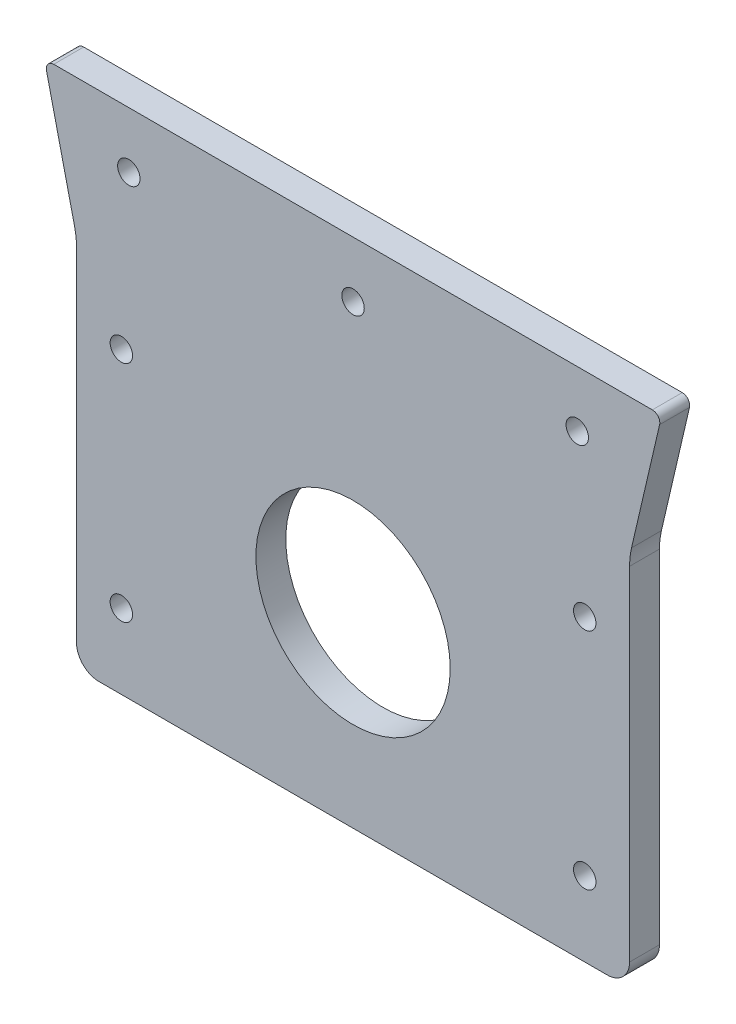
ISO-10303-21;
HEADER;
FILE_DESCRIPTION(('STEP AP214'),'2;1');
FILE_NAME('part.step','',(''),(''),'','','');
FILE_SCHEMA(('AUTOMOTIVE_DESIGN { 1 0 10303 214 1 1 1 1 }'));
ENDSEC;
DATA;
#1=APPLICATION_CONTEXT('core data for automotive mechanical design processes');
#2=APPLICATION_PROTOCOL_DEFINITION('international standard','automotive_design',2000,#1);
#3=PRODUCT_CONTEXT('',#1,'mechanical');
#4=PRODUCT('Part','Part','',(#3));
#5=PRODUCT_RELATED_PRODUCT_CATEGORY('part','',(#4));
#6=PRODUCT_DEFINITION_FORMATION('','',#4);
#7=PRODUCT_DEFINITION_CONTEXT('part definition',#1,'design');
#8=PRODUCT_DEFINITION('design','',#6,#7);
#9=PRODUCT_DEFINITION_SHAPE('','',#8);
#10=(LENGTH_UNIT() NAMED_UNIT(*) SI_UNIT(.MILLI.,.METRE.));
#11=(NAMED_UNIT(*) PLANE_ANGLE_UNIT() SI_UNIT($,.RADIAN.));
#12=(NAMED_UNIT(*) SI_UNIT($,.STERADIAN.) SOLID_ANGLE_UNIT());
#13=UNCERTAINTY_MEASURE_WITH_UNIT(LENGTH_MEASURE(1.E-05),#10,'distance_accuracy_value','');
#14=(GEOMETRIC_REPRESENTATION_CONTEXT(3) GLOBAL_UNCERTAINTY_ASSIGNED_CONTEXT((#13)) GLOBAL_UNIT_ASSIGNED_CONTEXT((#10,
#11,#12)) REPRESENTATION_CONTEXT('',''));
#15=CARTESIAN_POINT('',(0.,0.,0.));
#16=DIRECTION('',(0.,0.,1.));
#17=DIRECTION('',(1.,0.,0.));
#18=AXIS2_PLACEMENT_3D('',#15,#16,#17);
#19=CARTESIAN_POINT('',(0.,0.,4.));
#20=DIRECTION('',(0.,0.,1.));
#21=DIRECTION('',(1.,0.,0.));
#22=AXIS2_PLACEMENT_3D('',#19,#20,#21);
#23=PLANE('',#22);
#24=DIRECTION('',(0.226513494660278,0.974008027039196,0.));
#25=VECTOR('',#24,1.);
#26=CARTESIAN_POINT('',(29.5859415084659,-6.88045151359672,4.));
#27=LINE('',#26,#25);
#28=CARTESIAN_POINT('',(37.259919729608,26.1176548373145,4.));
#29=VERTEX_POINT('',#28);
#30=CARTESIAN_POINT('',(41.0170898849627,42.2734865053397,4.));
#31=VERTEX_POINT('',#30);
#32=EDGE_CURVE('E149',#29,#31,#27,.T.);
#33=ORIENTED_EDGE('',*,*,#32,.T.);
#34=CARTESIAN_POINT('',(40.0430818579235,42.5,4.));
#35=DIRECTION('',(0.,0.,1.));
#36=DIRECTION('',(1.,0.,0.));
#37=AXIS2_PLACEMENT_3D('',#34,#35,#36);
#38=CIRCLE('',#37,1.);
#39=CARTESIAN_POINT('',(40.0430818579235,43.5,4.));
#40=VERTEX_POINT('',#39);
#41=EDGE_CURVE('E205',#31,#40,#38,.T.);
#42=ORIENTED_EDGE('',*,*,#41,.T.);
#43=DIRECTION('',(1.,0.,0.));
#44=VECTOR('',#43,1.);
#45=CARTESIAN_POINT('',(-85.19901444117,43.5,4.));
#46=LINE('',#45,#44);
#47=CARTESIAN_POINT('',(-40.0430818579235,43.5,4.));
#48=VERTEX_POINT('',#47);
#49=EDGE_CURVE('E219',#48,#40,#46,.T.);
#50=ORIENTED_EDGE('',*,*,#49,.F.);
#51=CARTESIAN_POINT('',(-40.0430818579235,42.5,4.));
#52=DIRECTION('',(0.,0.,1.));
#53=DIRECTION('',(1.,0.,0.));
#54=AXIS2_PLACEMENT_3D('',#51,#52,#53);
#55=CIRCLE('',#54,1.);
#56=CARTESIAN_POINT('',(-41.0170898849627,42.2734865053397,4.));
#57=VERTEX_POINT('',#56);
#58=EDGE_CURVE('E203',#48,#57,#55,.T.);
#59=ORIENTED_EDGE('',*,*,#58,.T.);
#60=DIRECTION('',(-0.226513494660278,0.974008027039196,0.));
#61=VECTOR('',#60,1.);
#62=CARTESIAN_POINT('',(-29.5859415084659,-6.88045151359672,4.));
#63=LINE('',#62,#61);
#64=CARTESIAN_POINT('',(-37.259919729608,26.1176548373145,4.));
#65=VERTEX_POINT('',#64);
#66=EDGE_CURVE('E224',#65,#57,#63,.T.);
#67=ORIENTED_EDGE('',*,*,#66,.F.);
#68=CARTESIAN_POINT('',(-47.,23.8525198907117,4.));
#69=DIRECTION('',(0.,0.,1.));
#70=DIRECTION('',(1.,0.,0.));
#71=AXIS2_PLACEMENT_3D('',#68,#69,#70);
#72=CIRCLE('',#71,10.);
#73=CARTESIAN_POINT('',(-37.,23.8525198907117,4.));
#74=VERTEX_POINT('',#73);
#75=EDGE_CURVE('E180',#65,#74,#72,.F.);
#76=ORIENTED_EDGE('',*,*,#75,.T.);
#77=DIRECTION('',(0.,1.,0.));
#78=VECTOR('',#77,1.);
#79=CARTESIAN_POINT('',(-37.,0.,4.));
#80=LINE('',#79,#78);
#81=CARTESIAN_POINT('',(-37.,-22.,4.));
#82=VERTEX_POINT('',#81);
#83=EDGE_CURVE('E228',#82,#74,#80,.T.);
#84=ORIENTED_EDGE('',*,*,#83,.F.);
#85=CARTESIAN_POINT('',(-34.,-22.,4.));
#86=DIRECTION('',(0.,0.,1.));
#87=DIRECTION('',(1.,0.,0.));
#88=AXIS2_PLACEMENT_3D('',#85,#86,#87);
#89=CIRCLE('',#88,3.);
#90=CARTESIAN_POINT('',(-34.,-25.,4.));
#91=VERTEX_POINT('',#90);
#92=EDGE_CURVE('E195',#82,#91,#89,.T.);
#93=ORIENTED_EDGE('',*,*,#92,.T.);
#94=DIRECTION('',(1.,0.,0.));
#95=VECTOR('',#94,1.);
#96=CARTESIAN_POINT('',(0.,-25.,4.));
#97=LINE('',#96,#95);
#98=CARTESIAN_POINT('',(34.,-25.,4.));
#99=VERTEX_POINT('',#98);
#100=EDGE_CURVE('E230',#91,#99,#97,.T.);
#101=ORIENTED_EDGE('',*,*,#100,.T.);
#102=CARTESIAN_POINT('',(34.,-22.,4.));
#103=DIRECTION('',(0.,0.,1.));
#104=DIRECTION('',(1.,0.,0.));
#105=AXIS2_PLACEMENT_3D('',#102,#103,#104);
#106=CIRCLE('',#105,3.);
#107=CARTESIAN_POINT('',(37.,-22.,4.));
#108=VERTEX_POINT('',#107);
#109=EDGE_CURVE('E197',#99,#108,#106,.T.);
#110=ORIENTED_EDGE('',*,*,#109,.T.);
#111=DIRECTION('',(0.,1.,0.));
#112=VECTOR('',#111,1.);
#113=CARTESIAN_POINT('',(37.,0.,4.));
#114=LINE('',#113,#112);
#115=CARTESIAN_POINT('',(37.,23.8525198907117,4.));
#116=VERTEX_POINT('',#115);
#117=EDGE_CURVE('E150',#108,#116,#114,.T.);
#118=ORIENTED_EDGE('',*,*,#117,.T.);
#119=CARTESIAN_POINT('',(47.,23.8525198907117,4.));
#120=DIRECTION('',(0.,0.,1.));
#121=DIRECTION('',(1.,0.,0.));
#122=AXIS2_PLACEMENT_3D('',#119,#120,#121);
#123=CIRCLE('',#122,10.);
#124=EDGE_CURVE('E138',#116,#29,#123,.F.);
#125=ORIENTED_EDGE('',*,*,#124,.T.);
#126=EDGE_LOOP('',(#33,#42,#50,#59,#67,#76,#84,#93,#101,#110,#118,#125));
#127=FACE_BOUND('',#126,.T.);
#128=CARTESIAN_POINT('',(0.,36.,4.));
#129=DIRECTION('',(0.,0.,1.));
#130=DIRECTION('',(1.,0.,0.));
#131=AXIS2_PLACEMENT_3D('',#128,#129,#130);
#132=CIRCLE('',#131,1.5);
#133=CARTESIAN_POINT('',(1.50000000000001,36.,4.));
#134=VERTEX_POINT('',#133);
#135=EDGE_CURVE('E218',#134,#134,#132,.T.);
#136=ORIENTED_EDGE('',*,*,#135,.F.);
#137=EDGE_LOOP('',(#136));
#138=FACE_BOUND('',#137,.T.);
#139=CARTESIAN_POINT('',(-30.,36.,4.));
#140=DIRECTION('',(0.,0.,1.));
#141=DIRECTION('',(1.,0.,0.));
#142=AXIS2_PLACEMENT_3D('',#139,#140,#141);
#143=CIRCLE('',#142,1.5);
#144=CARTESIAN_POINT('',(-28.5,36.,4.));
#145=VERTEX_POINT('',#144);
#146=EDGE_CURVE('E362',#145,#145,#143,.T.);
#147=ORIENTED_EDGE('',*,*,#146,.F.);
#148=EDGE_LOOP('',(#147));
#149=FACE_BOUND('',#148,.T.);
#150=CARTESIAN_POINT('',(30.,36.,4.));
#151=DIRECTION('',(0.,0.,-1.));
#152=DIRECTION('',(-1.,0.,0.));
#153=AXIS2_PLACEMENT_3D('',#150,#151,#152);
#154=CIRCLE('',#153,1.5);
#155=CARTESIAN_POINT('',(28.5,36.,4.));
#156=VERTEX_POINT('',#155);
#157=EDGE_CURVE('E356',#156,#156,#154,.T.);
#158=ORIENTED_EDGE('',*,*,#157,.T.);
#159=EDGE_LOOP('',(#158));
#160=FACE_BOUND('',#159,.T.);
#161=CARTESIAN_POINT('',(0.,0.,4.));
#162=DIRECTION('',(0.,0.,1.));
#163=DIRECTION('',(1.,0.,0.));
#164=AXIS2_PLACEMENT_3D('',#161,#162,#163);
#165=CIRCLE('',#164,13.);
#166=CARTESIAN_POINT('',(13.,0.,4.));
#167=VERTEX_POINT('',#166);
#168=EDGE_CURVE('E353',#167,#167,#165,.T.);
#169=ORIENTED_EDGE('',*,*,#168,.F.);
#170=EDGE_LOOP('',(#169));
#171=FACE_BOUND('',#170,.T.);
#172=CARTESIAN_POINT('',(-31.,-15.,4.));
#173=DIRECTION('',(0.,0.,1.));
#174=DIRECTION('',(-1.,0.,0.));
#175=AXIS2_PLACEMENT_3D('',#172,#173,#174);
#176=CIRCLE('',#175,1.5);
#177=CARTESIAN_POINT('',(-32.5,-15.,4.));
#178=VERTEX_POINT('',#177);
#179=EDGE_CURVE('E347',#178,#178,#176,.T.);
#180=ORIENTED_EDGE('',*,*,#179,.F.);
#181=EDGE_LOOP('',(#180));
#182=FACE_BOUND('',#181,.T.);
#183=CARTESIAN_POINT('',(-31.,15.,4.));
#184=DIRECTION('',(0.,0.,-1.));
#185=DIRECTION('',(-1.,0.,0.));
#186=AXIS2_PLACEMENT_3D('',#183,#184,#185);
#187=CIRCLE('',#186,1.5);
#188=CARTESIAN_POINT('',(-32.5,15.,4.));
#189=VERTEX_POINT('',#188);
#190=EDGE_CURVE('E337',#189,#189,#187,.T.);
#191=ORIENTED_EDGE('',*,*,#190,.T.);
#192=EDGE_LOOP('',(#191));
#193=FACE_BOUND('',#192,.T.);
#194=CARTESIAN_POINT('',(31.,-15.,4.));
#195=DIRECTION('',(0.,0.,-1.));
#196=DIRECTION('',(1.,0.,0.));
#197=AXIS2_PLACEMENT_3D('',#194,#195,#196);
#198=CIRCLE('',#197,1.5);
#199=CARTESIAN_POINT('',(32.5,-15.,4.));
#200=VERTEX_POINT('',#199);
#201=EDGE_CURVE('E331',#200,#200,#198,.T.);
#202=ORIENTED_EDGE('',*,*,#201,.T.);
#203=EDGE_LOOP('',(#202));
#204=FACE_BOUND('',#203,.T.);
#205=CARTESIAN_POINT('',(31.,15.,4.));
#206=DIRECTION('',(0.,0.,1.));
#207=DIRECTION('',(1.,0.,0.));
#208=AXIS2_PLACEMENT_3D('',#205,#206,#207);
#209=CIRCLE('',#208,1.5);
#210=CARTESIAN_POINT('',(32.5,15.,4.));
#211=VERTEX_POINT('',#210);
#212=EDGE_CURVE('E161',#211,#211,#209,.T.);
#213=ORIENTED_EDGE('',*,*,#212,.F.);
#214=EDGE_LOOP('',(#213));
#215=FACE_BOUND('',#214,.T.);
#216=ADVANCED_FACE('F36',(#127,#138,#149,#160,#171,#182,#193,#204,#215),#23,.T.);
#217=CARTESIAN_POINT('',(0.,0.,0.));
#218=DIRECTION('',(0.,0.,1.));
#219=DIRECTION('',(1.,0.,0.));
#220=AXIS2_PLACEMENT_3D('',#217,#218,#219);
#221=PLANE('',#220);
#222=CARTESIAN_POINT('',(0.,36.,0.));
#223=DIRECTION('',(0.,0.,1.));
#224=DIRECTION('',(1.,0.,0.));
#225=AXIS2_PLACEMENT_3D('',#222,#223,#224);
#226=CIRCLE('',#225,1.5);
#227=CARTESIAN_POINT('',(1.50000000000001,36.,0.));
#228=VERTEX_POINT('',#227);
#229=EDGE_CURVE('E368',#228,#228,#226,.T.);
#230=ORIENTED_EDGE('',*,*,#229,.T.);
#231=EDGE_LOOP('',(#230));
#232=FACE_BOUND('',#231,.T.);
#233=CARTESIAN_POINT('',(31.,15.,0.));
#234=DIRECTION('',(0.,0.,1.));
#235=DIRECTION('',(1.,0.,0.));
#236=AXIS2_PLACEMENT_3D('',#233,#234,#235);
#237=CIRCLE('',#236,1.5);
#238=CARTESIAN_POINT('',(32.5,15.,0.));
#239=VERTEX_POINT('',#238);
#240=EDGE_CURVE('E156',#239,#239,#237,.T.);
#241=ORIENTED_EDGE('',*,*,#240,.T.);
#242=EDGE_LOOP('',(#241));
#243=FACE_BOUND('',#242,.T.);
#244=CARTESIAN_POINT('',(31.,-15.,0.));
#245=DIRECTION('',(0.,0.,-1.));
#246=DIRECTION('',(1.,0.,0.));
#247=AXIS2_PLACEMENT_3D('',#244,#245,#246);
#248=CIRCLE('',#247,1.5);
#249=CARTESIAN_POINT('',(32.5,-15.,0.));
#250=VERTEX_POINT('',#249);
#251=EDGE_CURVE('E328',#250,#250,#248,.T.);
#252=ORIENTED_EDGE('',*,*,#251,.F.);
#253=EDGE_LOOP('',(#252));
#254=FACE_BOUND('',#253,.T.);
#255=CARTESIAN_POINT('',(-31.,15.,0.));
#256=DIRECTION('',(0.,0.,-1.));
#257=DIRECTION('',(-1.,0.,0.));
#258=AXIS2_PLACEMENT_3D('',#255,#256,#257);
#259=CIRCLE('',#258,1.5);
#260=CARTESIAN_POINT('',(-32.5,15.,0.));
#261=VERTEX_POINT('',#260);
#262=EDGE_CURVE('E333',#261,#261,#259,.T.);
#263=ORIENTED_EDGE('',*,*,#262,.F.);
#264=EDGE_LOOP('',(#263));
#265=FACE_BOUND('',#264,.T.);
#266=CARTESIAN_POINT('',(-31.,-15.,0.));
#267=DIRECTION('',(0.,0.,1.));
#268=DIRECTION('',(-1.,0.,0.));
#269=AXIS2_PLACEMENT_3D('',#266,#267,#268);
#270=CIRCLE('',#269,1.5);
#271=CARTESIAN_POINT('',(-32.5,-15.,0.));
#272=VERTEX_POINT('',#271);
#273=EDGE_CURVE('E345',#272,#272,#270,.T.);
#274=ORIENTED_EDGE('',*,*,#273,.T.);
#275=EDGE_LOOP('',(#274));
#276=FACE_BOUND('',#275,.T.);
#277=CARTESIAN_POINT('',(0.,0.,0.));
#278=DIRECTION('',(0.,0.,1.));
#279=DIRECTION('',(1.,0.,0.));
#280=AXIS2_PLACEMENT_3D('',#277,#278,#279);
#281=CIRCLE('',#280,13.);
#282=CARTESIAN_POINT('',(13.,0.,0.));
#283=VERTEX_POINT('',#282);
#284=EDGE_CURVE('E350',#283,#283,#281,.T.);
#285=ORIENTED_EDGE('',*,*,#284,.T.);
#286=EDGE_LOOP('',(#285));
#287=FACE_BOUND('',#286,.T.);
#288=DIRECTION('',(1.,0.,0.));
#289=VECTOR('',#288,1.);
#290=CARTESIAN_POINT('',(-85.19901444117,43.5,0.));
#291=LINE('',#290,#289);
#292=CARTESIAN_POINT('',(-40.0430818579235,43.5,0.));
#293=VERTEX_POINT('',#292);
#294=CARTESIAN_POINT('',(40.0430818579235,43.5,0.));
#295=VERTEX_POINT('',#294);
#296=EDGE_CURVE('E213',#293,#295,#291,.T.);
#297=ORIENTED_EDGE('',*,*,#296,.T.);
#298=CARTESIAN_POINT('',(40.0430818579235,42.5,0.));
#299=DIRECTION('',(0.,0.,1.));
#300=DIRECTION('',(1.,0.,0.));
#301=AXIS2_PLACEMENT_3D('',#298,#299,#300);
#302=CIRCLE('',#301,1.);
#303=CARTESIAN_POINT('',(41.0170898849627,42.2734865053397,0.));
#304=VERTEX_POINT('',#303);
#305=EDGE_CURVE('E44',#295,#304,#302,.F.);
#306=ORIENTED_EDGE('',*,*,#305,.T.);
#307=DIRECTION('',(0.226513494660278,0.974008027039196,0.));
#308=VECTOR('',#307,1.);
#309=CARTESIAN_POINT('',(29.5859415084659,-6.88045151359672,0.));
#310=LINE('',#309,#308);
#311=CARTESIAN_POINT('',(37.259919729608,26.1176548373145,0.));
#312=VERTEX_POINT('',#311);
#313=EDGE_CURVE('E146',#312,#304,#310,.T.);
#314=ORIENTED_EDGE('',*,*,#313,.F.);
#315=CARTESIAN_POINT('',(47.,23.8525198907117,0.));
#316=DIRECTION('',(0.,0.,1.));
#317=DIRECTION('',(1.,0.,0.));
#318=AXIS2_PLACEMENT_3D('',#315,#316,#317);
#319=CIRCLE('',#318,10.);
#320=CARTESIAN_POINT('',(37.,23.8525198907117,0.));
#321=VERTEX_POINT('',#320);
#322=EDGE_CURVE('E128',#312,#321,#319,.T.);
#323=ORIENTED_EDGE('',*,*,#322,.T.);
#324=DIRECTION('',(0.,1.,0.));
#325=VECTOR('',#324,1.);
#326=CARTESIAN_POINT('',(37.,0.,0.));
#327=LINE('',#326,#325);
#328=CARTESIAN_POINT('',(37.,-22.,0.));
#329=VERTEX_POINT('',#328);
#330=EDGE_CURVE('E170',#329,#321,#327,.T.);
#331=ORIENTED_EDGE('',*,*,#330,.F.);
#332=CARTESIAN_POINT('',(34.,-22.,0.));
#333=DIRECTION('',(0.,0.,1.));
#334=DIRECTION('',(1.,0.,0.));
#335=AXIS2_PLACEMENT_3D('',#332,#333,#334);
#336=CIRCLE('',#335,3.);
#337=CARTESIAN_POINT('',(34.,-25.,0.));
#338=VERTEX_POINT('',#337);
#339=EDGE_CURVE('E188',#329,#338,#336,.F.);
#340=ORIENTED_EDGE('',*,*,#339,.T.);
#341=DIRECTION('',(1.,0.,0.));
#342=VECTOR('',#341,1.);
#343=CARTESIAN_POINT('',(0.,-25.,0.));
#344=LINE('',#343,#342);
#345=CARTESIAN_POINT('',(-34.,-25.,0.));
#346=VERTEX_POINT('',#345);
#347=EDGE_CURVE('E167',#346,#338,#344,.T.);
#348=ORIENTED_EDGE('',*,*,#347,.F.);
#349=CARTESIAN_POINT('',(-34.,-22.,0.));
#350=DIRECTION('',(0.,0.,1.));
#351=DIRECTION('',(1.,0.,0.));
#352=AXIS2_PLACEMENT_3D('',#349,#350,#351);
#353=CIRCLE('',#352,3.);
#354=CARTESIAN_POINT('',(-37.,-22.,0.));
#355=VERTEX_POINT('',#354);
#356=EDGE_CURVE('E186',#346,#355,#353,.F.);
#357=ORIENTED_EDGE('',*,*,#356,.T.);
#358=DIRECTION('',(0.,1.,0.));
#359=VECTOR('',#358,1.);
#360=CARTESIAN_POINT('',(-37.,0.,0.));
#361=LINE('',#360,#359);
#362=CARTESIAN_POINT('',(-37.,23.8525198907117,0.));
#363=VERTEX_POINT('',#362);
#364=EDGE_CURVE('E158',#355,#363,#361,.T.);
#365=ORIENTED_EDGE('',*,*,#364,.T.);
#366=CARTESIAN_POINT('',(-47.,23.8525198907117,0.));
#367=DIRECTION('',(0.,0.,1.));
#368=DIRECTION('',(1.,0.,0.));
#369=AXIS2_PLACEMENT_3D('',#366,#367,#368);
#370=CIRCLE('',#369,10.);
#371=CARTESIAN_POINT('',(-37.259919729608,26.1176548373145,0.));
#372=VERTEX_POINT('',#371);
#373=EDGE_CURVE('E178',#363,#372,#370,.T.);
#374=ORIENTED_EDGE('',*,*,#373,.T.);
#375=DIRECTION('',(-0.226513494660278,0.974008027039196,0.));
#376=VECTOR('',#375,1.);
#377=CARTESIAN_POINT('',(-29.5859415084659,-6.88045151359672,0.));
#378=LINE('',#377,#376);
#379=CARTESIAN_POINT('',(-41.0170898849627,42.2734865053397,0.));
#380=VERTEX_POINT('',#379);
#381=EDGE_CURVE('E155',#372,#380,#378,.T.);
#382=ORIENTED_EDGE('',*,*,#381,.T.);
#383=CARTESIAN_POINT('',(-40.0430818579235,42.5,0.));
#384=DIRECTION('',(0.,0.,1.));
#385=DIRECTION('',(1.,0.,0.));
#386=AXIS2_PLACEMENT_3D('',#383,#384,#385);
#387=CIRCLE('',#386,1.);
#388=EDGE_CURVE('E211',#380,#293,#387,.F.);
#389=ORIENTED_EDGE('',*,*,#388,.T.);
#390=EDGE_LOOP('',(#297,#306,#314,#323,#331,#340,#348,#357,#365,#374,#382,#389));
#391=FACE_BOUND('',#390,.T.);
#392=CARTESIAN_POINT('',(30.,36.,0.));
#393=DIRECTION('',(0.,0.,-1.));
#394=DIRECTION('',(-1.,0.,0.));
#395=AXIS2_PLACEMENT_3D('',#392,#393,#394);
#396=CIRCLE('',#395,1.5);
#397=CARTESIAN_POINT('',(28.5,36.,0.));
#398=VERTEX_POINT('',#397);
#399=EDGE_CURVE('E359',#398,#398,#396,.T.);
#400=ORIENTED_EDGE('',*,*,#399,.F.);
#401=EDGE_LOOP('',(#400));
#402=FACE_BOUND('',#401,.T.);
#403=CARTESIAN_POINT('',(-30.,36.,0.));
#404=DIRECTION('',(0.,0.,1.));
#405=DIRECTION('',(1.,0.,0.));
#406=AXIS2_PLACEMENT_3D('',#403,#404,#405);
#407=CIRCLE('',#406,1.5);
#408=CARTESIAN_POINT('',(-28.5,36.,0.));
#409=VERTEX_POINT('',#408);
#410=EDGE_CURVE('E365',#409,#409,#407,.T.);
#411=ORIENTED_EDGE('',*,*,#410,.T.);
#412=EDGE_LOOP('',(#411));
#413=FACE_BOUND('',#412,.T.);
#414=ADVANCED_FACE('F152',(#232,#243,#254,#265,#276,#287,#391,#402,#413),#221,.F.);
#415=CARTESIAN_POINT('',(29.5859415084659,-6.88045151359672,4.));
#416=DIRECTION('',(-0.974008027039196,0.226513494660279,0.));
#417=DIRECTION('',(-0.226513494660279,-0.974008027039196,0.));
#418=AXIS2_PLACEMENT_3D('',#415,#416,#417);
#419=PLANE('',#418);
#420=ORIENTED_EDGE('',*,*,#313,.T.);
#421=DIRECTION('',(0.,0.,1.));
#422=VECTOR('',#421,1.);
#423=CARTESIAN_POINT('',(41.0170898849627,42.2734865053397,4.));
#424=LINE('',#423,#422);
#425=EDGE_CURVE('E201',#304,#31,#424,.T.);
#426=ORIENTED_EDGE('',*,*,#425,.T.);
#427=ORIENTED_EDGE('',*,*,#32,.F.);
#428=DIRECTION('',(0.,0.,-1.));
#429=VECTOR('',#428,1.);
#430=CARTESIAN_POINT('',(37.259919729608,26.1176548373145,0.));
#431=LINE('',#430,#429);
#432=EDGE_CURVE('E132',#29,#312,#431,.T.);
#433=ORIENTED_EDGE('',*,*,#432,.T.);
#434=EDGE_LOOP('',(#420,#426,#427,#433));
#435=FACE_BOUND('',#434,.T.);
#436=ADVANCED_FACE('F144',(#435),#419,.F.);
#437=CARTESIAN_POINT('',(-29.5859415084659,-6.88045151359672,4.));
#438=DIRECTION('',(-0.974008027039196,-0.226513494660279,0.));
#439=DIRECTION('',(0.226513494660279,-0.974008027039196,0.));
#440=AXIS2_PLACEMENT_3D('',#437,#438,#439);
#441=PLANE('',#440);
#442=ORIENTED_EDGE('',*,*,#66,.T.);
#443=DIRECTION('',(0.,0.,1.));
#444=VECTOR('',#443,1.);
#445=CARTESIAN_POINT('',(-41.0170898849627,42.2734865053397,0.));
#446=LINE('',#445,#444);
#447=EDGE_CURVE('E11',#57,#380,#446,.F.);
#448=ORIENTED_EDGE('',*,*,#447,.T.);
#449=ORIENTED_EDGE('',*,*,#381,.F.);
#450=DIRECTION('',(0.,0.,-1.));
#451=VECTOR('',#450,1.);
#452=CARTESIAN_POINT('',(-37.259919729608,26.1176548373145,4.));
#453=LINE('',#452,#451);
#454=EDGE_CURVE('E139',#372,#65,#453,.F.);
#455=ORIENTED_EDGE('',*,*,#454,.T.);
#456=EDGE_LOOP('',(#442,#448,#449,#455));
#457=FACE_BOUND('',#456,.T.);
#458=ADVANCED_FACE('F226',(#457),#441,.T.);
#459=CARTESIAN_POINT('',(-37.,0.,4.));
#460=DIRECTION('',(-1.,0.,0.));
#461=DIRECTION('',(0.,0.,1.));
#462=AXIS2_PLACEMENT_3D('',#459,#460,#461);
#463=PLANE('',#462);
#464=ORIENTED_EDGE('',*,*,#364,.F.);
#465=DIRECTION('',(0.,0.,-1.));
#466=VECTOR('',#465,1.);
#467=CARTESIAN_POINT('',(-37.,-22.,4.));
#468=LINE('',#467,#466);
#469=EDGE_CURVE('E199',#355,#82,#468,.F.);
#470=ORIENTED_EDGE('',*,*,#469,.T.);
#471=ORIENTED_EDGE('',*,*,#83,.T.);
#472=DIRECTION('',(0.,0.,-1.));
#473=VECTOR('',#472,1.);
#474=CARTESIAN_POINT('',(-37.,23.8525198907117,0.));
#475=LINE('',#474,#473);
#476=EDGE_CURVE('E173',#74,#363,#475,.T.);
#477=ORIENTED_EDGE('',*,*,#476,.T.);
#478=EDGE_LOOP('',(#464,#470,#471,#477));
#479=FACE_BOUND('',#478,.T.);
#480=ADVANCED_FACE('F278',(#479),#463,.T.);
#481=CARTESIAN_POINT('',(0.,-25.,4.));
#482=DIRECTION('',(0.,1.,0.));
#483=DIRECTION('',(0.,0.,1.));
#484=AXIS2_PLACEMENT_3D('',#481,#482,#483);
#485=PLANE('',#484);
#486=ORIENTED_EDGE('',*,*,#347,.T.);
#487=DIRECTION('',(0.,0.,-1.));
#488=VECTOR('',#487,1.);
#489=CARTESIAN_POINT('',(34.,-25.,4.));
#490=LINE('',#489,#488);
#491=EDGE_CURVE('E193',#338,#99,#490,.F.);
#492=ORIENTED_EDGE('',*,*,#491,.T.);
#493=ORIENTED_EDGE('',*,*,#100,.F.);
#494=DIRECTION('',(0.,0.,-1.));
#495=VECTOR('',#494,1.);
#496=CARTESIAN_POINT('',(-34.,-25.,0.));
#497=LINE('',#496,#495);
#498=EDGE_CURVE('E190',#91,#346,#497,.T.);
#499=ORIENTED_EDGE('',*,*,#498,.T.);
#500=EDGE_LOOP('',(#486,#492,#493,#499));
#501=FACE_BOUND('',#500,.T.);
#502=ADVANCED_FACE('F245',(#501),#485,.F.);
#503=CARTESIAN_POINT('',(37.,0.,4.));
#504=DIRECTION('',(-1.,0.,0.));
#505=DIRECTION('',(0.,0.,1.));
#506=AXIS2_PLACEMENT_3D('',#503,#504,#505);
#507=PLANE('',#506);
#508=ORIENTED_EDGE('',*,*,#117,.F.);
#509=DIRECTION('',(0.,0.,-1.));
#510=VECTOR('',#509,1.);
#511=CARTESIAN_POINT('',(37.,-22.,4.));
#512=LINE('',#511,#510);
#513=EDGE_CURVE('E183',#108,#329,#512,.T.);
#514=ORIENTED_EDGE('',*,*,#513,.T.);
#515=ORIENTED_EDGE('',*,*,#330,.T.);
#516=DIRECTION('',(0.,0.,-1.));
#517=VECTOR('',#516,1.);
#518=CARTESIAN_POINT('',(37.,23.8525198907117,4.));
#519=LINE('',#518,#517);
#520=EDGE_CURVE('E134',#321,#116,#519,.F.);
#521=ORIENTED_EDGE('',*,*,#520,.T.);
#522=EDGE_LOOP('',(#508,#514,#515,#521));
#523=FACE_BOUND('',#522,.T.);
#524=ADVANCED_FACE('F240',(#523),#507,.F.);
#525=CARTESIAN_POINT('',(31.,15.,0.));
#526=DIRECTION('',(0.,0.,1.));
#527=DIRECTION('',(1.,0.,0.));
#528=AXIS2_PLACEMENT_3D('',#525,#526,#527);
#529=CYLINDRICAL_SURFACE('',#528,1.5);
#530=ORIENTED_EDGE('',*,*,#240,.F.);
#531=EDGE_LOOP('',(#530));
#532=FACE_BOUND('',#531,.T.);
#533=ORIENTED_EDGE('',*,*,#212,.T.);
#534=EDGE_LOOP('',(#533));
#535=FACE_BOUND('',#534,.T.);
#536=ADVANCED_FACE('F271',(#532,#535),#529,.F.);
#537=CARTESIAN_POINT('',(31.,-15.,0.));
#538=DIRECTION('',(0.,0.,1.));
#539=DIRECTION('',(1.,0.,0.));
#540=AXIS2_PLACEMENT_3D('',#537,#538,#539);
#541=CYLINDRICAL_SURFACE('',#540,1.5);
#542=ORIENTED_EDGE('',*,*,#251,.T.);
#543=EDGE_LOOP('',(#542));
#544=FACE_BOUND('',#543,.T.);
#545=ORIENTED_EDGE('',*,*,#201,.F.);
#546=EDGE_LOOP('',(#545));
#547=FACE_BOUND('',#546,.T.);
#548=ADVANCED_FACE('F317',(#544,#547),#541,.F.);
#549=CARTESIAN_POINT('',(-31.,15.,0.));
#550=DIRECTION('',(0.,0.,1.));
#551=DIRECTION('',(1.,0.,0.));
#552=AXIS2_PLACEMENT_3D('',#549,#550,#551);
#553=CYLINDRICAL_SURFACE('',#552,1.5);
#554=ORIENTED_EDGE('',*,*,#262,.T.);
#555=EDGE_LOOP('',(#554));
#556=FACE_BOUND('',#555,.T.);
#557=ORIENTED_EDGE('',*,*,#190,.F.);
#558=EDGE_LOOP('',(#557));
#559=FACE_BOUND('',#558,.T.);
#560=ADVANCED_FACE('F314',(#556,#559),#553,.F.);
#561=CARTESIAN_POINT('',(-31.,-15.,0.));
#562=DIRECTION('',(0.,0.,1.));
#563=DIRECTION('',(1.,0.,0.));
#564=AXIS2_PLACEMENT_3D('',#561,#562,#563);
#565=CYLINDRICAL_SURFACE('',#564,1.5);
#566=ORIENTED_EDGE('',*,*,#273,.F.);
#567=EDGE_LOOP('',(#566));
#568=FACE_BOUND('',#567,.T.);
#569=ORIENTED_EDGE('',*,*,#179,.T.);
#570=EDGE_LOOP('',(#569));
#571=FACE_BOUND('',#570,.T.);
#572=ADVANCED_FACE('F310',(#568,#571),#565,.F.);
#573=CARTESIAN_POINT('',(0.,0.,0.));
#574=DIRECTION('',(0.,0.,1.));
#575=DIRECTION('',(1.,0.,0.));
#576=AXIS2_PLACEMENT_3D('',#573,#574,#575);
#577=CYLINDRICAL_SURFACE('',#576,13.);
#578=ORIENTED_EDGE('',*,*,#284,.F.);
#579=EDGE_LOOP('',(#578));
#580=FACE_BOUND('',#579,.T.);
#581=ORIENTED_EDGE('',*,*,#168,.T.);
#582=EDGE_LOOP('',(#581));
#583=FACE_BOUND('',#582,.T.);
#584=ADVANCED_FACE('F288',(#580,#583),#577,.F.);
#585=CARTESIAN_POINT('',(47.,23.8525198907117,4.));
#586=DIRECTION('',(0.,0.,1.));
#587=DIRECTION('',(1.,0.,0.));
#588=AXIS2_PLACEMENT_3D('',#585,#586,#587);
#589=CYLINDRICAL_SURFACE('',#588,10.);
#590=ORIENTED_EDGE('',*,*,#124,.F.);
#591=ORIENTED_EDGE('',*,*,#520,.F.);
#592=ORIENTED_EDGE('',*,*,#322,.F.);
#593=ORIENTED_EDGE('',*,*,#432,.F.);
#594=EDGE_LOOP('',(#590,#591,#592,#593));
#595=FACE_BOUND('',#594,.T.);
#596=ADVANCED_FACE('F131',(#595),#589,.F.);
#597=CARTESIAN_POINT('',(-47.,23.8525198907117,4.));
#598=DIRECTION('',(0.,0.,1.));
#599=DIRECTION('',(1.,0.,0.));
#600=AXIS2_PLACEMENT_3D('',#597,#598,#599);
#601=CYLINDRICAL_SURFACE('',#600,10.);
#602=ORIENTED_EDGE('',*,*,#75,.F.);
#603=ORIENTED_EDGE('',*,*,#454,.F.);
#604=ORIENTED_EDGE('',*,*,#373,.F.);
#605=ORIENTED_EDGE('',*,*,#476,.F.);
#606=EDGE_LOOP('',(#602,#603,#604,#605));
#607=FACE_BOUND('',#606,.T.);
#608=ADVANCED_FACE('F287',(#607),#601,.F.);
#609=CARTESIAN_POINT('',(30.,36.,4.));
#610=DIRECTION('',(0.,0.,-1.));
#611=DIRECTION('',(-1.,0.,0.));
#612=AXIS2_PLACEMENT_3D('',#609,#610,#611);
#613=CYLINDRICAL_SURFACE('',#612,1.5);
#614=ORIENTED_EDGE('',*,*,#157,.F.);
#615=EDGE_LOOP('',(#614));
#616=FACE_BOUND('',#615,.T.);
#617=ORIENTED_EDGE('',*,*,#399,.T.);
#618=EDGE_LOOP('',(#617));
#619=FACE_BOUND('',#618,.T.);
#620=ADVANCED_FACE('F259',(#616,#619),#613,.F.);
#621=CARTESIAN_POINT('',(-30.,36.,4.));
#622=DIRECTION('',(0.,0.,-1.));
#623=DIRECTION('',(-1.,0.,0.));
#624=AXIS2_PLACEMENT_3D('',#621,#622,#623);
#625=CYLINDRICAL_SURFACE('',#624,1.5);
#626=ORIENTED_EDGE('',*,*,#146,.T.);
#627=EDGE_LOOP('',(#626));
#628=FACE_BOUND('',#627,.T.);
#629=ORIENTED_EDGE('',*,*,#410,.F.);
#630=EDGE_LOOP('',(#629));
#631=FACE_BOUND('',#630,.T.);
#632=ADVANCED_FACE('F250',(#628,#631),#625,.F.);
#633=CARTESIAN_POINT('',(34.,-22.,4.));
#634=DIRECTION('',(0.,0.,-1.));
#635=DIRECTION('',(-1.,0.,0.));
#636=AXIS2_PLACEMENT_3D('',#633,#634,#635);
#637=CYLINDRICAL_SURFACE('',#636,3.);
#638=ORIENTED_EDGE('',*,*,#109,.F.);
#639=ORIENTED_EDGE('',*,*,#491,.F.);
#640=ORIENTED_EDGE('',*,*,#339,.F.);
#641=ORIENTED_EDGE('',*,*,#513,.F.);
#642=EDGE_LOOP('',(#638,#639,#640,#641));
#643=FACE_BOUND('',#642,.T.);
#644=ADVANCED_FACE('F247',(#643),#637,.T.);
#645=CARTESIAN_POINT('',(-34.,-22.,4.));
#646=DIRECTION('',(0.,0.,1.));
#647=DIRECTION('',(1.,0.,0.));
#648=AXIS2_PLACEMENT_3D('',#645,#646,#647);
#649=CYLINDRICAL_SURFACE('',#648,3.);
#650=ORIENTED_EDGE('',*,*,#92,.F.);
#651=ORIENTED_EDGE('',*,*,#469,.F.);
#652=ORIENTED_EDGE('',*,*,#356,.F.);
#653=ORIENTED_EDGE('',*,*,#498,.F.);
#654=EDGE_LOOP('',(#650,#651,#652,#653));
#655=FACE_BOUND('',#654,.T.);
#656=ADVANCED_FACE('F249',(#655),#649,.T.);
#657=CARTESIAN_POINT('',(0.,36.,0.));
#658=DIRECTION('',(0.,0.,1.));
#659=DIRECTION('',(1.,0.,0.));
#660=AXIS2_PLACEMENT_3D('',#657,#658,#659);
#661=CYLINDRICAL_SURFACE('',#660,1.5);
#662=ORIENTED_EDGE('',*,*,#229,.F.);
#663=EDGE_LOOP('',(#662));
#664=FACE_BOUND('',#663,.T.);
#665=ORIENTED_EDGE('',*,*,#135,.T.);
#666=EDGE_LOOP('',(#665));
#667=FACE_BOUND('',#666,.T.);
#668=ADVANCED_FACE('F256',(#664,#667),#661,.F.);
#669=CARTESIAN_POINT('',(-85.19901444117,43.5,0.));
#670=DIRECTION('',(0.,-1.,0.));
#671=DIRECTION('',(0.,0.,-1.));
#672=AXIS2_PLACEMENT_3D('',#669,#670,#671);
#673=PLANE('',#672);
#674=ORIENTED_EDGE('',*,*,#49,.T.);
#675=DIRECTION('',(0.,0.,1.));
#676=VECTOR('',#675,1.);
#677=CARTESIAN_POINT('',(40.0430818579235,43.5,0.));
#678=LINE('',#677,#676);
#679=EDGE_CURVE('E57',#40,#295,#678,.F.);
#680=ORIENTED_EDGE('',*,*,#679,.T.);
#681=ORIENTED_EDGE('',*,*,#296,.F.);
#682=DIRECTION('',(0.,0.,1.));
#683=VECTOR('',#682,1.);
#684=CARTESIAN_POINT('',(-40.0430818579235,43.5,4.));
#685=LINE('',#684,#683);
#686=EDGE_CURVE('E207',#293,#48,#685,.T.);
#687=ORIENTED_EDGE('',*,*,#686,.T.);
#688=EDGE_LOOP('',(#674,#680,#681,#687));
#689=FACE_BOUND('',#688,.T.);
#690=ADVANCED_FACE('F216',(#689),#673,.F.);
#691=CARTESIAN_POINT('',(40.0430818579235,42.5,4.));
#692=DIRECTION('',(0.,0.,1.));
#693=DIRECTION('',(1.,0.,0.));
#694=AXIS2_PLACEMENT_3D('',#691,#692,#693);
#695=CYLINDRICAL_SURFACE('',#694,1.);
#696=ORIENTED_EDGE('',*,*,#305,.F.);
#697=ORIENTED_EDGE('',*,*,#679,.F.);
#698=ORIENTED_EDGE('',*,*,#41,.F.);
#699=ORIENTED_EDGE('',*,*,#425,.F.);
#700=EDGE_LOOP('',(#696,#697,#698,#699));
#701=FACE_BOUND('',#700,.T.);
#702=ADVANCED_FACE('F376',(#701),#695,.T.);
#703=CARTESIAN_POINT('',(-40.0430818579235,42.5,0.));
#704=DIRECTION('',(0.,0.,-1.));
#705=DIRECTION('',(-1.,0.,0.));
#706=AXIS2_PLACEMENT_3D('',#703,#704,#705);
#707=CYLINDRICAL_SURFACE('',#706,1.);
#708=ORIENTED_EDGE('',*,*,#388,.F.);
#709=ORIENTED_EDGE('',*,*,#447,.F.);
#710=ORIENTED_EDGE('',*,*,#58,.F.);
#711=ORIENTED_EDGE('',*,*,#686,.F.);
#712=EDGE_LOOP('',(#708,#709,#710,#711));
#713=FACE_BOUND('',#712,.T.);
#714=ADVANCED_FACE('F38',(#713),#707,.T.);
#715=CLOSED_SHELL('',(#216,#414,#436,#458,#480,#502,#524,#536,#548,#560,#572,#584,#596,#608,
#620,#632,#644,#656,#668,#690,#702,#714));
#716=MANIFOLD_SOLID_BREP('B2',#715);
#717=ADVANCED_BREP_SHAPE_REPRESENTATION('',(#18,#716),#14);
#718=SHAPE_DEFINITION_REPRESENTATION(#9,#717);
ENDSEC;
END-ISO-10303-21;
